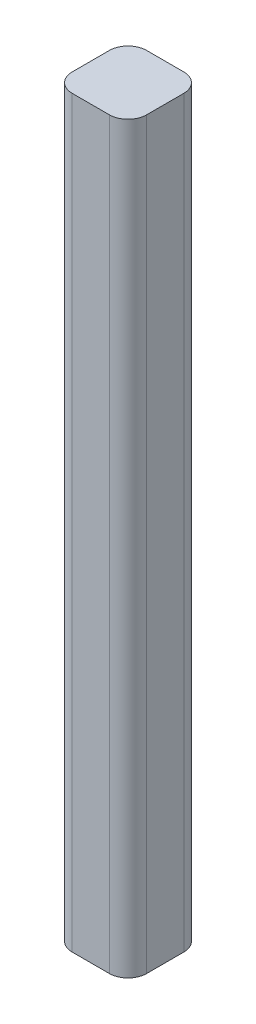
ISO-10303-21;
HEADER;
FILE_DESCRIPTION(('STEP AP214'),'2;1');
FILE_NAME('part.step','',(''),(''),'','','');
FILE_SCHEMA(('AUTOMOTIVE_DESIGN { 1 0 10303 214 1 1 1 1 }'));
ENDSEC;
DATA;
#1=APPLICATION_CONTEXT('core data for automotive mechanical design processes');
#2=APPLICATION_PROTOCOL_DEFINITION('international standard','automotive_design',2000,#1);
#3=PRODUCT_CONTEXT('',#1,'mechanical');
#4=PRODUCT('Part','Part','',(#3));
#5=PRODUCT_RELATED_PRODUCT_CATEGORY('part','',(#4));
#6=PRODUCT_DEFINITION_FORMATION('','',#4);
#7=PRODUCT_DEFINITION_CONTEXT('part definition',#1,'design');
#8=PRODUCT_DEFINITION('design','',#6,#7);
#9=PRODUCT_DEFINITION_SHAPE('','',#8);
#10=(LENGTH_UNIT() NAMED_UNIT(*) SI_UNIT(.MILLI.,.METRE.));
#11=(NAMED_UNIT(*) PLANE_ANGLE_UNIT() SI_UNIT($,.RADIAN.));
#12=(NAMED_UNIT(*) SI_UNIT($,.STERADIAN.) SOLID_ANGLE_UNIT());
#13=UNCERTAINTY_MEASURE_WITH_UNIT(LENGTH_MEASURE(1.E-05),#10,'distance_accuracy_value','');
#14=(GEOMETRIC_REPRESENTATION_CONTEXT(3) GLOBAL_UNCERTAINTY_ASSIGNED_CONTEXT((#13)) GLOBAL_UNIT_ASSIGNED_CONTEXT((#10,
#11,#12)) REPRESENTATION_CONTEXT('',''));
#15=CARTESIAN_POINT('',(0.,0.,0.));
#16=DIRECTION('',(0.,0.,1.));
#17=DIRECTION('',(1.,0.,0.));
#18=AXIS2_PLACEMENT_3D('',#15,#16,#17);
#19=CARTESIAN_POINT('',(2.,80.,-2.));
#20=DIRECTION('',(0.,-1.,0.));
#21=DIRECTION('',(0.,0.,-1.));
#22=AXIS2_PLACEMENT_3D('',#19,#20,#21);
#23=CYLINDRICAL_SURFACE('',#22,2.);
#24=CARTESIAN_POINT('',(2.,0.,-2.));
#25=DIRECTION('',(0.,1.,0.));
#26=DIRECTION('',(0.,0.,-1.));
#27=AXIS2_PLACEMENT_3D('',#24,#25,#26);
#28=CIRCLE('',#27,2.);
#29=CARTESIAN_POINT('',(4.,0.,-2.));
#30=VERTEX_POINT('',#29);
#31=CARTESIAN_POINT('',(2.,0.,-4.));
#32=VERTEX_POINT('',#31);
#33=EDGE_CURVE('E129',#30,#32,#28,.T.);
#34=ORIENTED_EDGE('',*,*,#33,.T.);
#35=DIRECTION('',(0.,-1.,0.));
#36=VECTOR('',#35,1.);
#37=CARTESIAN_POINT('',(2.,80.,-4.));
#38=LINE('',#37,#36);
#39=CARTESIAN_POINT('',(2.,80.,-4.));
#40=VERTEX_POINT('',#39);
#41=EDGE_CURVE('E11',#40,#32,#38,.T.);
#42=ORIENTED_EDGE('',*,*,#41,.F.);
#43=CARTESIAN_POINT('',(2.,80.,-2.));
#44=DIRECTION('',(0.,1.,0.));
#45=DIRECTION('',(0.,0.,-1.));
#46=AXIS2_PLACEMENT_3D('',#43,#44,#45);
#47=CIRCLE('',#46,2.);
#48=CARTESIAN_POINT('',(4.,80.,-2.));
#49=VERTEX_POINT('',#48);
#50=EDGE_CURVE('E143',#49,#40,#47,.T.);
#51=ORIENTED_EDGE('',*,*,#50,.F.);
#52=DIRECTION('',(0.,-1.,0.));
#53=VECTOR('',#52,1.);
#54=CARTESIAN_POINT('',(4.,80.,-2.));
#55=LINE('',#54,#53);
#56=EDGE_CURVE('E125',#49,#30,#55,.T.);
#57=ORIENTED_EDGE('',*,*,#56,.T.);
#58=EDGE_LOOP('',(#34,#42,#51,#57));
#59=FACE_BOUND('',#58,.T.);
#60=ADVANCED_FACE('F33',(#59),#23,.T.);
#61=CARTESIAN_POINT('',(-2.,80.,-4.));
#62=DIRECTION('',(0.,0.,1.));
#63=DIRECTION('',(1.,0.,0.));
#64=AXIS2_PLACEMENT_3D('',#61,#62,#63);
#65=PLANE('',#64);
#66=DIRECTION('',(-1.,0.,0.));
#67=VECTOR('',#66,1.);
#68=CARTESIAN_POINT('',(-2.,0.,-4.));
#69=LINE('',#68,#67);
#70=CARTESIAN_POINT('',(-2.,0.,-4.));
#71=VERTEX_POINT('',#70);
#72=EDGE_CURVE('E132',#32,#71,#69,.T.);
#73=ORIENTED_EDGE('',*,*,#72,.T.);
#74=DIRECTION('',(0.,-1.,0.));
#75=VECTOR('',#74,1.);
#76=CARTESIAN_POINT('',(-2.,80.,-4.));
#77=LINE('',#76,#75);
#78=CARTESIAN_POINT('',(-2.,80.,-4.));
#79=VERTEX_POINT('',#78);
#80=EDGE_CURVE('E41',#79,#71,#77,.T.);
#81=ORIENTED_EDGE('',*,*,#80,.F.);
#82=DIRECTION('',(-1.,0.,0.));
#83=VECTOR('',#82,1.);
#84=CARTESIAN_POINT('',(-2.,80.,-4.));
#85=LINE('',#84,#83);
#86=EDGE_CURVE('E92',#40,#79,#85,.T.);
#87=ORIENTED_EDGE('',*,*,#86,.F.);
#88=ORIENTED_EDGE('',*,*,#41,.T.);
#89=EDGE_LOOP('',(#73,#81,#87,#88));
#90=FACE_BOUND('',#89,.T.);
#91=ADVANCED_FACE('F178',(#90),#65,.F.);
#92=CARTESIAN_POINT('',(-2.,80.,-2.));
#93=DIRECTION('',(0.,-1.,0.));
#94=DIRECTION('',(0.,0.,-1.));
#95=AXIS2_PLACEMENT_3D('',#92,#93,#94);
#96=CYLINDRICAL_SURFACE('',#95,2.);
#97=CARTESIAN_POINT('',(-2.,0.,-2.));
#98=DIRECTION('',(0.,1.,0.));
#99=DIRECTION('',(0.,0.,-1.));
#100=AXIS2_PLACEMENT_3D('',#97,#98,#99);
#101=CIRCLE('',#100,2.);
#102=CARTESIAN_POINT('',(-4.,0.,-2.));
#103=VERTEX_POINT('',#102);
#104=EDGE_CURVE('E134',#71,#103,#101,.T.);
#105=ORIENTED_EDGE('',*,*,#104,.T.);
#106=DIRECTION('',(0.,-1.,0.));
#107=VECTOR('',#106,1.);
#108=CARTESIAN_POINT('',(-4.,80.,-2.));
#109=LINE('',#108,#107);
#110=CARTESIAN_POINT('',(-4.,80.,-2.));
#111=VERTEX_POINT('',#110);
#112=EDGE_CURVE('E150',#111,#103,#109,.T.);
#113=ORIENTED_EDGE('',*,*,#112,.F.);
#114=CARTESIAN_POINT('',(-2.,80.,-2.));
#115=DIRECTION('',(0.,1.,0.));
#116=DIRECTION('',(0.,0.,-1.));
#117=AXIS2_PLACEMENT_3D('',#114,#115,#116);
#118=CIRCLE('',#117,2.);
#119=EDGE_CURVE('E158',#79,#111,#118,.T.);
#120=ORIENTED_EDGE('',*,*,#119,.F.);
#121=ORIENTED_EDGE('',*,*,#80,.T.);
#122=EDGE_LOOP('',(#105,#113,#120,#121));
#123=FACE_BOUND('',#122,.T.);
#124=ADVANCED_FACE('F156',(#123),#96,.T.);
#125=CARTESIAN_POINT('',(-4.,80.,2.));
#126=DIRECTION('',(1.,0.,0.));
#127=DIRECTION('',(0.,0.,-1.));
#128=AXIS2_PLACEMENT_3D('',#125,#126,#127);
#129=PLANE('',#128);
#130=DIRECTION('',(0.,0.,1.));
#131=VECTOR('',#130,1.);
#132=CARTESIAN_POINT('',(-4.,0.,2.));
#133=LINE('',#132,#131);
#134=CARTESIAN_POINT('',(-4.,0.,2.));
#135=VERTEX_POINT('',#134);
#136=EDGE_CURVE('E136',#103,#135,#133,.T.);
#137=ORIENTED_EDGE('',*,*,#136,.T.);
#138=DIRECTION('',(0.,-1.,0.));
#139=VECTOR('',#138,1.);
#140=CARTESIAN_POINT('',(-4.,80.,2.));
#141=LINE('',#140,#139);
#142=CARTESIAN_POINT('',(-4.,80.,2.));
#143=VERTEX_POINT('',#142);
#144=EDGE_CURVE('E147',#143,#135,#141,.T.);
#145=ORIENTED_EDGE('',*,*,#144,.F.);
#146=DIRECTION('',(0.,0.,1.));
#147=VECTOR('',#146,1.);
#148=CARTESIAN_POINT('',(-4.,80.,2.));
#149=LINE('',#148,#147);
#150=EDGE_CURVE('E170',#111,#143,#149,.T.);
#151=ORIENTED_EDGE('',*,*,#150,.F.);
#152=ORIENTED_EDGE('',*,*,#112,.T.);
#153=EDGE_LOOP('',(#137,#145,#151,#152));
#154=FACE_BOUND('',#153,.T.);
#155=ADVANCED_FACE('F166',(#154),#129,.F.);
#156=CARTESIAN_POINT('',(-2.,80.,2.));
#157=DIRECTION('',(0.,-1.,0.));
#158=DIRECTION('',(0.,0.,-1.));
#159=AXIS2_PLACEMENT_3D('',#156,#157,#158);
#160=CYLINDRICAL_SURFACE('',#159,2.);
#161=CARTESIAN_POINT('',(-2.,0.,2.));
#162=DIRECTION('',(0.,1.,0.));
#163=DIRECTION('',(0.,0.,-1.));
#164=AXIS2_PLACEMENT_3D('',#161,#162,#163);
#165=CIRCLE('',#164,2.);
#166=CARTESIAN_POINT('',(-2.,0.,4.));
#167=VERTEX_POINT('',#166);
#168=EDGE_CURVE('E138',#135,#167,#165,.T.);
#169=ORIENTED_EDGE('',*,*,#168,.T.);
#170=DIRECTION('',(0.,-1.,0.));
#171=VECTOR('',#170,1.);
#172=CARTESIAN_POINT('',(-2.,80.,4.));
#173=LINE('',#172,#171);
#174=CARTESIAN_POINT('',(-2.,80.,4.));
#175=VERTEX_POINT('',#174);
#176=EDGE_CURVE('E120',#175,#167,#173,.T.);
#177=ORIENTED_EDGE('',*,*,#176,.F.);
#178=CARTESIAN_POINT('',(-2.,80.,2.));
#179=DIRECTION('',(0.,1.,0.));
#180=DIRECTION('',(0.,0.,-1.));
#181=AXIS2_PLACEMENT_3D('',#178,#179,#180);
#182=CIRCLE('',#181,2.);
#183=EDGE_CURVE('E111',#143,#175,#182,.T.);
#184=ORIENTED_EDGE('',*,*,#183,.F.);
#185=ORIENTED_EDGE('',*,*,#144,.T.);
#186=EDGE_LOOP('',(#169,#177,#184,#185));
#187=FACE_BOUND('',#186,.T.);
#188=ADVANCED_FACE('F169',(#187),#160,.T.);
#189=CARTESIAN_POINT('',(-2.,80.,4.));
#190=DIRECTION('',(0.,0.,-1.));
#191=DIRECTION('',(-1.,0.,0.));
#192=AXIS2_PLACEMENT_3D('',#189,#190,#191);
#193=PLANE('',#192);
#194=DIRECTION('',(1.,0.,0.));
#195=VECTOR('',#194,1.);
#196=CARTESIAN_POINT('',(-2.,0.,4.));
#197=LINE('',#196,#195);
#198=CARTESIAN_POINT('',(2.,0.,4.));
#199=VERTEX_POINT('',#198);
#200=EDGE_CURVE('E119',#167,#199,#197,.T.);
#201=ORIENTED_EDGE('',*,*,#200,.T.);
#202=DIRECTION('',(0.,-1.,0.));
#203=VECTOR('',#202,1.);
#204=CARTESIAN_POINT('',(2.,80.,4.));
#205=LINE('',#204,#203);
#206=CARTESIAN_POINT('',(2.,80.,4.));
#207=VERTEX_POINT('',#206);
#208=EDGE_CURVE('E116',#207,#199,#205,.T.);
#209=ORIENTED_EDGE('',*,*,#208,.F.);
#210=DIRECTION('',(1.,0.,0.));
#211=VECTOR('',#210,1.);
#212=CARTESIAN_POINT('',(-2.,80.,4.));
#213=LINE('',#212,#211);
#214=EDGE_CURVE('E105',#175,#207,#213,.T.);
#215=ORIENTED_EDGE('',*,*,#214,.F.);
#216=ORIENTED_EDGE('',*,*,#176,.T.);
#217=EDGE_LOOP('',(#201,#209,#215,#216));
#218=FACE_BOUND('',#217,.T.);
#219=ADVANCED_FACE('F117',(#218),#193,.F.);
#220=CARTESIAN_POINT('',(2.,80.,2.));
#221=DIRECTION('',(0.,-1.,0.));
#222=DIRECTION('',(0.,0.,-1.));
#223=AXIS2_PLACEMENT_3D('',#220,#221,#222);
#224=CYLINDRICAL_SURFACE('',#223,2.);
#225=CARTESIAN_POINT('',(2.,0.,2.));
#226=DIRECTION('',(0.,1.,0.));
#227=DIRECTION('',(0.,0.,-1.));
#228=AXIS2_PLACEMENT_3D('',#225,#226,#227);
#229=CIRCLE('',#228,2.);
#230=CARTESIAN_POINT('',(4.,0.,2.));
#231=VERTEX_POINT('',#230);
#232=EDGE_CURVE('E78',#199,#231,#229,.T.);
#233=ORIENTED_EDGE('',*,*,#232,.T.);
#234=DIRECTION('',(0.,-1.,0.));
#235=VECTOR('',#234,1.);
#236=CARTESIAN_POINT('',(4.,80.,2.));
#237=LINE('',#236,#235);
#238=CARTESIAN_POINT('',(4.,80.,2.));
#239=VERTEX_POINT('',#238);
#240=EDGE_CURVE('E121',#239,#231,#237,.T.);
#241=ORIENTED_EDGE('',*,*,#240,.F.);
#242=CARTESIAN_POINT('',(2.,80.,2.));
#243=DIRECTION('',(0.,1.,0.));
#244=DIRECTION('',(0.,0.,-1.));
#245=AXIS2_PLACEMENT_3D('',#242,#243,#244);
#246=CIRCLE('',#245,2.);
#247=EDGE_CURVE('E109',#207,#239,#246,.T.);
#248=ORIENTED_EDGE('',*,*,#247,.F.);
#249=ORIENTED_EDGE('',*,*,#208,.T.);
#250=EDGE_LOOP('',(#233,#241,#248,#249));
#251=FACE_BOUND('',#250,.T.);
#252=ADVANCED_FACE('F123',(#251),#224,.T.);
#253=CARTESIAN_POINT('',(4.,80.,2.));
#254=DIRECTION('',(-1.,0.,0.));
#255=DIRECTION('',(0.,0.,1.));
#256=AXIS2_PLACEMENT_3D('',#253,#254,#255);
#257=PLANE('',#256);
#258=DIRECTION('',(0.,0.,-1.));
#259=VECTOR('',#258,1.);
#260=CARTESIAN_POINT('',(4.,0.,2.));
#261=LINE('',#260,#259);
#262=EDGE_CURVE('E84',#231,#30,#261,.T.);
#263=ORIENTED_EDGE('',*,*,#262,.T.);
#264=ORIENTED_EDGE('',*,*,#56,.F.);
#265=DIRECTION('',(0.,0.,-1.));
#266=VECTOR('',#265,1.);
#267=CARTESIAN_POINT('',(4.,80.,2.));
#268=LINE('',#267,#266);
#269=EDGE_CURVE('E49',#239,#49,#268,.T.);
#270=ORIENTED_EDGE('',*,*,#269,.F.);
#271=ORIENTED_EDGE('',*,*,#240,.T.);
#272=EDGE_LOOP('',(#263,#264,#270,#271));
#273=FACE_BOUND('',#272,.T.);
#274=ADVANCED_FACE('F194',(#273),#257,.F.);
#275=CARTESIAN_POINT('',(2.,80.,-2.));
#276=DIRECTION('',(0.,-1.,0.));
#277=DIRECTION('',(0.,0.,-1.));
#278=AXIS2_PLACEMENT_3D('',#275,#276,#277);
#279=PLANE('',#278);
#280=ORIENTED_EDGE('',*,*,#50,.T.);
#281=ORIENTED_EDGE('',*,*,#86,.T.);
#282=ORIENTED_EDGE('',*,*,#119,.T.);
#283=ORIENTED_EDGE('',*,*,#150,.T.);
#284=ORIENTED_EDGE('',*,*,#183,.T.);
#285=ORIENTED_EDGE('',*,*,#214,.T.);
#286=ORIENTED_EDGE('',*,*,#247,.T.);
#287=ORIENTED_EDGE('',*,*,#269,.T.);
#288=EDGE_LOOP('',(#280,#281,#282,#283,#284,#285,#286,#287));
#289=FACE_BOUND('',#288,.T.);
#290=ADVANCED_FACE('F107',(#289),#279,.F.);
#291=CARTESIAN_POINT('',(2.,0.,-2.));
#292=DIRECTION('',(0.,-1.,0.));
#293=DIRECTION('',(0.,0.,-1.));
#294=AXIS2_PLACEMENT_3D('',#291,#292,#293);
#295=PLANE('',#294);
#296=ORIENTED_EDGE('',*,*,#33,.F.);
#297=ORIENTED_EDGE('',*,*,#262,.F.);
#298=ORIENTED_EDGE('',*,*,#232,.F.);
#299=ORIENTED_EDGE('',*,*,#200,.F.);
#300=ORIENTED_EDGE('',*,*,#168,.F.);
#301=ORIENTED_EDGE('',*,*,#136,.F.);
#302=ORIENTED_EDGE('',*,*,#104,.F.);
#303=ORIENTED_EDGE('',*,*,#72,.F.);
#304=EDGE_LOOP('',(#296,#297,#298,#299,#300,#301,#302,#303));
#305=FACE_BOUND('',#304,.T.);
#306=ADVANCED_FACE('F162',(#305),#295,.T.);
#307=CLOSED_SHELL('',(#60,#91,#124,#155,#188,#219,#252,#274,#290,#306));
#308=MANIFOLD_SOLID_BREP('B2',#307);
#309=ADVANCED_BREP_SHAPE_REPRESENTATION('',(#18,#308),#14);
#310=SHAPE_DEFINITION_REPRESENTATION(#9,#309);
ENDSEC;
END-ISO-10303-21;
